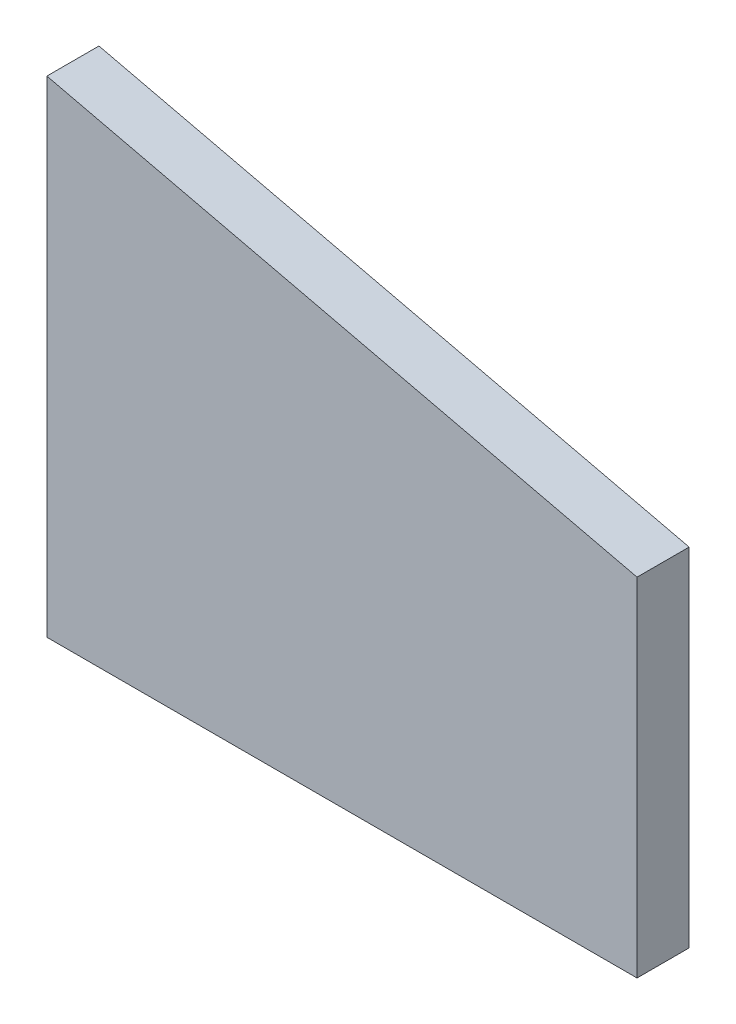
ISO-10303-21;
HEADER;
FILE_DESCRIPTION(('STEP AP214'),'2;1');
FILE_NAME('part.step','',(''),(''),'','','');
FILE_SCHEMA(('AUTOMOTIVE_DESIGN { 1 0 10303 214 1 1 1 1 }'));
ENDSEC;
DATA;
#1=APPLICATION_CONTEXT('core data for automotive mechanical design processes');
#2=APPLICATION_PROTOCOL_DEFINITION('international standard','automotive_design',2000,#1);
#3=PRODUCT_CONTEXT('',#1,'mechanical');
#4=PRODUCT('Part','Part','',(#3));
#5=PRODUCT_RELATED_PRODUCT_CATEGORY('part','',(#4));
#6=PRODUCT_DEFINITION_FORMATION('','',#4);
#7=PRODUCT_DEFINITION_CONTEXT('part definition',#1,'design');
#8=PRODUCT_DEFINITION('design','',#6,#7);
#9=PRODUCT_DEFINITION_SHAPE('','',#8);
#10=(LENGTH_UNIT() NAMED_UNIT(*) SI_UNIT(.MILLI.,.METRE.));
#11=(NAMED_UNIT(*) PLANE_ANGLE_UNIT() SI_UNIT($,.RADIAN.));
#12=(NAMED_UNIT(*) SI_UNIT($,.STERADIAN.) SOLID_ANGLE_UNIT());
#13=UNCERTAINTY_MEASURE_WITH_UNIT(LENGTH_MEASURE(1.E-05),#10,'distance_accuracy_value','');
#14=(GEOMETRIC_REPRESENTATION_CONTEXT(3) GLOBAL_UNCERTAINTY_ASSIGNED_CONTEXT((#13)) GLOBAL_UNIT_ASSIGNED_CONTEXT((#10,
#11,#12)) REPRESENTATION_CONTEXT('',''));
#15=CARTESIAN_POINT('',(0.,0.,0.));
#16=DIRECTION('',(0.,0.,1.));
#17=DIRECTION('',(1.,0.,0.));
#18=AXIS2_PLACEMENT_3D('',#15,#16,#17);
#19=CARTESIAN_POINT('',(0.,0.,19.05));
#20=DIRECTION('',(1.,0.,0.));
#21=DIRECTION('',(0.,0.,-1.));
#22=AXIS2_PLACEMENT_3D('',#19,#20,#21);
#23=PLANE('',#22);
#24=DIRECTION('',(0.,-1.,0.));
#25=VECTOR('',#24,1.);
#26=CARTESIAN_POINT('',(0.,0.,0.));
#27=LINE('',#26,#25);
#28=CARTESIAN_POINT('',(0.,177.8,0.));
#29=VERTEX_POINT('',#28);
#30=CARTESIAN_POINT('',(0.,0.,0.));
#31=VERTEX_POINT('',#30);
#32=EDGE_CURVE('E100',#29,#31,#27,.T.);
#33=ORIENTED_EDGE('',*,*,#32,.T.);
#34=DIRECTION('',(0.,0.,-1.));
#35=VECTOR('',#34,1.);
#36=CARTESIAN_POINT('',(0.,0.,19.05));
#37=LINE('',#36,#35);
#38=CARTESIAN_POINT('',(0.,0.,19.05));
#39=VERTEX_POINT('',#38);
#40=EDGE_CURVE('E11',#39,#31,#37,.T.);
#41=ORIENTED_EDGE('',*,*,#40,.F.);
#42=DIRECTION('',(0.,-1.,0.));
#43=VECTOR('',#42,1.);
#44=CARTESIAN_POINT('',(0.,0.,19.05));
#45=LINE('',#44,#43);
#46=CARTESIAN_POINT('',(0.,177.8,19.05));
#47=VERTEX_POINT('',#46);
#48=EDGE_CURVE('E88',#47,#39,#45,.T.);
#49=ORIENTED_EDGE('',*,*,#48,.F.);
#50=DIRECTION('',(0.,0.,-1.));
#51=VECTOR('',#50,1.);
#52=CARTESIAN_POINT('',(0.,177.8,19.05));
#53=LINE('',#52,#51);
#54=EDGE_CURVE('E96',#47,#29,#53,.T.);
#55=ORIENTED_EDGE('',*,*,#54,.T.);
#56=EDGE_LOOP('',(#33,#41,#49,#55));
#57=FACE_BOUND('',#56,.T.);
#58=ADVANCED_FACE('F37',(#57),#23,.F.);
#59=CARTESIAN_POINT('',(0.,0.,19.05));
#60=DIRECTION('',(0.,1.,0.));
#61=DIRECTION('',(0.,0.,1.));
#62=AXIS2_PLACEMENT_3D('',#59,#60,#61);
#63=PLANE('',#62);
#64=DIRECTION('',(1.,0.,0.));
#65=VECTOR('',#64,1.);
#66=CARTESIAN_POINT('',(0.,0.,0.));
#67=LINE('',#66,#65);
#68=CARTESIAN_POINT('',(215.9,0.,0.));
#69=VERTEX_POINT('',#68);
#70=EDGE_CURVE('E92',#31,#69,#67,.T.);
#71=ORIENTED_EDGE('',*,*,#70,.T.);
#72=DIRECTION('',(0.,0.,-1.));
#73=VECTOR('',#72,1.);
#74=CARTESIAN_POINT('',(215.9,0.,19.05));
#75=LINE('',#74,#73);
#76=CARTESIAN_POINT('',(215.9,0.,19.05));
#77=VERTEX_POINT('',#76);
#78=EDGE_CURVE('E45',#77,#69,#75,.T.);
#79=ORIENTED_EDGE('',*,*,#78,.F.);
#80=DIRECTION('',(1.,0.,0.));
#81=VECTOR('',#80,1.);
#82=CARTESIAN_POINT('',(0.,0.,19.05));
#83=LINE('',#82,#81);
#84=EDGE_CURVE('E83',#39,#77,#83,.T.);
#85=ORIENTED_EDGE('',*,*,#84,.F.);
#86=ORIENTED_EDGE('',*,*,#40,.T.);
#87=EDGE_LOOP('',(#71,#79,#85,#86));
#88=FACE_BOUND('',#87,.T.);
#89=ADVANCED_FACE('F91',(#88),#63,.F.);
#90=CARTESIAN_POINT('',(215.9,0.,19.05));
#91=DIRECTION('',(-1.,0.,0.));
#92=DIRECTION('',(0.,0.,1.));
#93=AXIS2_PLACEMENT_3D('',#90,#91,#92);
#94=PLANE('',#93);
#95=DIRECTION('',(0.,1.,0.));
#96=VECTOR('',#95,1.);
#97=CARTESIAN_POINT('',(215.9,0.,0.));
#98=LINE('',#97,#96);
#99=CARTESIAN_POINT('',(215.9,127.,0.));
#100=VERTEX_POINT('',#99);
#101=EDGE_CURVE('E70',#69,#100,#98,.T.);
#102=ORIENTED_EDGE('',*,*,#101,.T.);
#103=DIRECTION('',(0.,0.,-1.));
#104=VECTOR('',#103,1.);
#105=CARTESIAN_POINT('',(215.9,127.,19.05));
#106=LINE('',#105,#104);
#107=CARTESIAN_POINT('',(215.9,127.,19.05));
#108=VERTEX_POINT('',#107);
#109=EDGE_CURVE('E93',#108,#100,#106,.T.);
#110=ORIENTED_EDGE('',*,*,#109,.F.);
#111=DIRECTION('',(0.,1.,0.));
#112=VECTOR('',#111,1.);
#113=CARTESIAN_POINT('',(215.9,0.,19.05));
#114=LINE('',#113,#112);
#115=EDGE_CURVE('E86',#77,#108,#114,.T.);
#116=ORIENTED_EDGE('',*,*,#115,.F.);
#117=ORIENTED_EDGE('',*,*,#78,.T.);
#118=EDGE_LOOP('',(#102,#110,#116,#117));
#119=FACE_BOUND('',#118,.T.);
#120=ADVANCED_FACE('F94',(#119),#94,.F.);
#121=CARTESIAN_POINT('',(0.,177.8,19.05));
#122=DIRECTION('',(-0.229039333725547,-0.973417168333576,0.));
#123=DIRECTION('',(0.973417168333576,-0.229039333725547,0.));
#124=AXIS2_PLACEMENT_3D('',#121,#122,#123);
#125=PLANE('',#124);
#126=DIRECTION('',(-0.973417168333576,0.229039333725547,0.));
#127=VECTOR('',#126,1.);
#128=CARTESIAN_POINT('',(0.,177.8,0.));
#129=LINE('',#128,#127);
#130=EDGE_CURVE('E76',#100,#29,#129,.T.);
#131=ORIENTED_EDGE('',*,*,#130,.T.);
#132=ORIENTED_EDGE('',*,*,#54,.F.);
#133=DIRECTION('',(-0.973417168333576,0.229039333725547,0.));
#134=VECTOR('',#133,1.);
#135=CARTESIAN_POINT('',(0.,177.8,19.05));
#136=LINE('',#135,#134);
#137=EDGE_CURVE('E53',#108,#47,#136,.T.);
#138=ORIENTED_EDGE('',*,*,#137,.F.);
#139=ORIENTED_EDGE('',*,*,#109,.T.);
#140=EDGE_LOOP('',(#131,#132,#138,#139));
#141=FACE_BOUND('',#140,.T.);
#142=ADVANCED_FACE('F107',(#141),#125,.F.);
#143=CARTESIAN_POINT('',(0.,0.,19.05));
#144=DIRECTION('',(0.,0.,-1.));
#145=DIRECTION('',(-1.,0.,0.));
#146=AXIS2_PLACEMENT_3D('',#143,#144,#145);
#147=PLANE('',#146);
#148=ORIENTED_EDGE('',*,*,#48,.T.);
#149=ORIENTED_EDGE('',*,*,#84,.T.);
#150=ORIENTED_EDGE('',*,*,#115,.T.);
#151=ORIENTED_EDGE('',*,*,#137,.T.);
#152=EDGE_LOOP('',(#148,#149,#150,#151));
#153=FACE_BOUND('',#152,.T.);
#154=ADVANCED_FACE('F84',(#153),#147,.F.);
#155=CARTESIAN_POINT('',(0.,0.,0.));
#156=DIRECTION('',(0.,0.,-1.));
#157=DIRECTION('',(-1.,0.,0.));
#158=AXIS2_PLACEMENT_3D('',#155,#156,#157);
#159=PLANE('',#158);
#160=ORIENTED_EDGE('',*,*,#32,.F.);
#161=ORIENTED_EDGE('',*,*,#130,.F.);
#162=ORIENTED_EDGE('',*,*,#101,.F.);
#163=ORIENTED_EDGE('',*,*,#70,.F.);
#164=EDGE_LOOP('',(#160,#161,#162,#163));
#165=FACE_BOUND('',#164,.T.);
#166=ADVANCED_FACE('F110',(#165),#159,.T.);
#167=CLOSED_SHELL('',(#58,#89,#120,#142,#154,#166));
#168=MANIFOLD_SOLID_BREP('B2',#167);
#169=ADVANCED_BREP_SHAPE_REPRESENTATION('',(#18,#168),#14);
#170=SHAPE_DEFINITION_REPRESENTATION(#9,#169);
ENDSEC;
END-ISO-10303-21;
